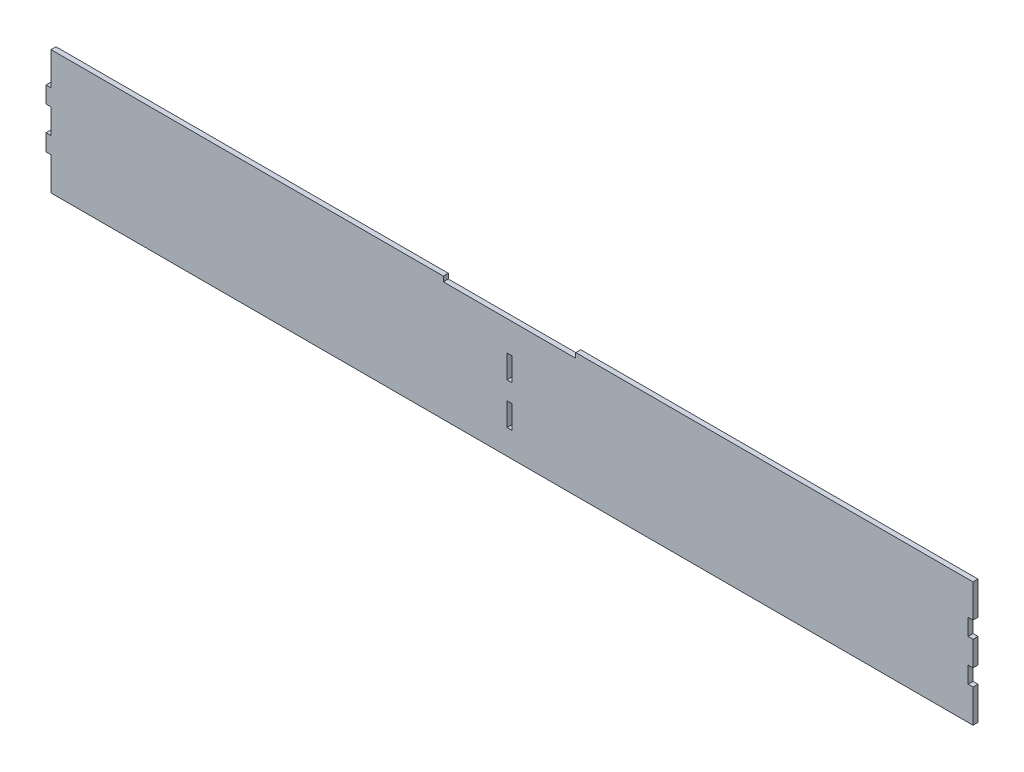
ISO-10303-21;
HEADER;
FILE_DESCRIPTION(('STEP AP214'),'2;1');
FILE_NAME('part.step','',(''),(''),'','','');
FILE_SCHEMA(('AUTOMOTIVE_DESIGN { 1 0 10303 214 1 1 1 1 }'));
ENDSEC;
DATA;
#1=APPLICATION_CONTEXT('core data for automotive mechanical design processes');
#2=APPLICATION_PROTOCOL_DEFINITION('international standard','automotive_design',2000,#1);
#3=PRODUCT_CONTEXT('',#1,'mechanical');
#4=PRODUCT('Part','Part','',(#3));
#5=PRODUCT_RELATED_PRODUCT_CATEGORY('part','',(#4));
#6=PRODUCT_DEFINITION_FORMATION('','',#4);
#7=PRODUCT_DEFINITION_CONTEXT('part definition',#1,'design');
#8=PRODUCT_DEFINITION('design','',#6,#7);
#9=PRODUCT_DEFINITION_SHAPE('','',#8);
#10=(LENGTH_UNIT() NAMED_UNIT(*) SI_UNIT(.MILLI.,.METRE.));
#11=(NAMED_UNIT(*) PLANE_ANGLE_UNIT() SI_UNIT($,.RADIAN.));
#12=(NAMED_UNIT(*) SI_UNIT($,.STERADIAN.) SOLID_ANGLE_UNIT());
#13=UNCERTAINTY_MEASURE_WITH_UNIT(LENGTH_MEASURE(1.E-05),#10,'distance_accuracy_value','');
#14=(GEOMETRIC_REPRESENTATION_CONTEXT(3) GLOBAL_UNCERTAINTY_ASSIGNED_CONTEXT((#13)) GLOBAL_UNIT_ASSIGNED_CONTEXT((#10,
#11,#12)) REPRESENTATION_CONTEXT('',''));
#15=CARTESIAN_POINT('',(0.,0.,0.));
#16=DIRECTION('',(0.,0.,1.));
#17=DIRECTION('',(1.,0.,0.));
#18=AXIS2_PLACEMENT_3D('',#15,#16,#17);
#19=CARTESIAN_POINT('',(-232.344937666755,214.488975695473,3.));
#20=DIRECTION('',(0.,1.,0.));
#21=DIRECTION('',(0.,0.,1.));
#22=AXIS2_PLACEMENT_3D('',#19,#20,#21);
#23=PLANE('',#22);
#24=DIRECTION('',(1.,0.,0.));
#25=VECTOR('',#24,1.);
#26=CARTESIAN_POINT('',(-232.344937666755,214.488975695473,0.));
#27=LINE('',#26,#25);
#28=CARTESIAN_POINT('',(87.6550623332451,214.488975695473,0.));
#29=VERTEX_POINT('',#28);
#30=CARTESIAN_POINT('',(327.655062333245,214.488975695473,0.));
#31=VERTEX_POINT('',#30);
#32=EDGE_CURVE('E554',#29,#31,#27,.T.);
#33=ORIENTED_EDGE('',*,*,#32,.F.);
#34=DIRECTION('',(0.,0.,1.));
#35=VECTOR('',#34,1.);
#36=CARTESIAN_POINT('',(87.6550623332451,214.488975695473,0.));
#37=LINE('',#36,#35);
#38=CARTESIAN_POINT('',(87.6550623332452,214.488975695473,3.));
#39=VERTEX_POINT('',#38);
#40=EDGE_CURVE('E327',#29,#39,#37,.T.);
#41=ORIENTED_EDGE('',*,*,#40,.T.);
#42=DIRECTION('',(1.,0.,0.));
#43=VECTOR('',#42,1.);
#44=CARTESIAN_POINT('',(-232.344937666755,214.488975695473,3.));
#45=LINE('',#44,#43);
#46=CARTESIAN_POINT('',(327.655062333245,214.488975695473,3.));
#47=VERTEX_POINT('',#46);
#48=EDGE_CURVE('E457',#39,#47,#45,.T.);
#49=ORIENTED_EDGE('',*,*,#48,.T.);
#50=DIRECTION('',(0.,0.,-1.));
#51=VECTOR('',#50,1.);
#52=CARTESIAN_POINT('',(327.655062333245,214.488975695473,3.));
#53=LINE('',#52,#51);
#54=EDGE_CURVE('E481',#47,#31,#53,.T.);
#55=ORIENTED_EDGE('',*,*,#54,.T.);
#56=EDGE_LOOP('',(#33,#41,#49,#55));
#57=FACE_BOUND('',#56,.T.);
#58=ADVANCED_FACE('F39',(#57),#23,.T.);
#59=CARTESIAN_POINT('',(0.,0.,3.));
#60=DIRECTION('',(0.,0.,-1.));
#61=DIRECTION('',(-1.,0.,0.));
#62=AXIS2_PLACEMENT_3D('',#59,#60,#61);
#63=PLANE('',#62);
#64=DIRECTION('',(0.,1.,0.));
#65=VECTOR('',#64,1.);
#66=CARTESIAN_POINT('',(49.1550623332451,0.,3.));
#67=LINE('',#66,#65);
#68=CARTESIAN_POINT('',(49.1550623332451,179.488975695473,3.));
#69=VERTEX_POINT('',#68);
#70=CARTESIAN_POINT('',(49.1550623332451,193.488975695473,3.));
#71=VERTEX_POINT('',#70);
#72=EDGE_CURVE('E264',#69,#71,#67,.T.);
#73=ORIENTED_EDGE('',*,*,#72,.F.);
#74=DIRECTION('',(1.,0.,0.));
#75=VECTOR('',#74,1.);
#76=CARTESIAN_POINT('',(0.,179.488975695473,3.));
#77=LINE('',#76,#75);
#78=CARTESIAN_POINT('',(46.1550623332451,179.488975695473,3.));
#79=VERTEX_POINT('',#78);
#80=EDGE_CURVE('E54',#79,#69,#77,.T.);
#81=ORIENTED_EDGE('',*,*,#80,.F.);
#82=DIRECTION('',(0.,1.,0.));
#83=VECTOR('',#82,1.);
#84=CARTESIAN_POINT('',(46.1550623332451,0.,3.));
#85=LINE('',#84,#83);
#86=CARTESIAN_POINT('',(46.1550623332451,193.488975695473,3.));
#87=VERTEX_POINT('',#86);
#88=EDGE_CURVE('E271',#79,#87,#85,.T.);
#89=ORIENTED_EDGE('',*,*,#88,.T.);
#90=DIRECTION('',(1.,0.,0.));
#91=VECTOR('',#90,1.);
#92=CARTESIAN_POINT('',(0.,193.488975695473,3.));
#93=LINE('',#92,#91);
#94=EDGE_CURVE('E254',#87,#71,#93,.T.);
#95=ORIENTED_EDGE('',*,*,#94,.T.);
#96=EDGE_LOOP('',(#73,#81,#89,#95));
#97=FACE_BOUND('',#96,.T.);
#98=DIRECTION('',(0.,1.,0.));
#99=VECTOR('',#98,1.);
#100=CARTESIAN_POINT('',(49.1550623332451,0.,3.));
#101=LINE('',#100,#99);
#102=CARTESIAN_POINT('',(49.1550623332451,154.488975695473,3.));
#103=VERTEX_POINT('',#102);
#104=CARTESIAN_POINT('',(49.1550623332451,168.488975695473,3.));
#105=VERTEX_POINT('',#104);
#106=EDGE_CURVE('E282',#103,#105,#101,.T.);
#107=ORIENTED_EDGE('',*,*,#106,.F.);
#108=DIRECTION('',(1.,0.,0.));
#109=VECTOR('',#108,1.);
#110=CARTESIAN_POINT('',(0.,154.488975695473,3.));
#111=LINE('',#110,#109);
#112=CARTESIAN_POINT('',(46.1550623332451,154.488975695473,3.));
#113=VERTEX_POINT('',#112);
#114=EDGE_CURVE('E62',#113,#103,#111,.T.);
#115=ORIENTED_EDGE('',*,*,#114,.F.);
#116=DIRECTION('',(0.,1.,0.));
#117=VECTOR('',#116,1.);
#118=CARTESIAN_POINT('',(46.1550623332451,0.,3.));
#119=LINE('',#118,#117);
#120=CARTESIAN_POINT('',(46.1550623332451,168.488975695473,3.));
#121=VERTEX_POINT('',#120);
#122=EDGE_CURVE('E288',#113,#121,#119,.T.);
#123=ORIENTED_EDGE('',*,*,#122,.T.);
#124=DIRECTION('',(1.,0.,0.));
#125=VECTOR('',#124,1.);
#126=CARTESIAN_POINT('',(0.,168.488975695473,3.));
#127=LINE('',#126,#125);
#128=EDGE_CURVE('E285',#121,#105,#127,.T.);
#129=ORIENTED_EDGE('',*,*,#128,.T.);
#130=EDGE_LOOP('',(#107,#115,#123,#129));
#131=FACE_BOUND('',#130,.T.);
#132=DIRECTION('',(1.,0.,0.));
#133=VECTOR('',#132,1.);
#134=CARTESIAN_POINT('',(7.65506233324513,211.488975695473,3.));
#135=LINE('',#134,#133);
#136=CARTESIAN_POINT('',(7.65506233324513,211.488975695473,3.));
#137=VERTEX_POINT('',#136);
#138=CARTESIAN_POINT('',(87.6550623332451,211.488975695473,3.));
#139=VERTEX_POINT('',#138);
#140=EDGE_CURVE('E278',#137,#139,#135,.T.);
#141=ORIENTED_EDGE('',*,*,#140,.F.);
#142=DIRECTION('',(0.,-1.,0.));
#143=VECTOR('',#142,1.);
#144=CARTESIAN_POINT('',(7.65506233324513,214.488975695473,3.));
#145=LINE('',#144,#143);
#146=CARTESIAN_POINT('',(7.65506233324513,214.488975695473,3.));
#147=VERTEX_POINT('',#146);
#148=EDGE_CURVE('E303',#147,#137,#145,.T.);
#149=ORIENTED_EDGE('',*,*,#148,.F.);
#150=CARTESIAN_POINT('',(-229.344937666755,214.488975695473,3.));
#151=VERTEX_POINT('',#150);
#152=EDGE_CURVE('E356',#151,#147,#45,.T.);
#153=ORIENTED_EDGE('',*,*,#152,.F.);
#154=DIRECTION('',(0.,-1.,0.));
#155=VECTOR('',#154,1.);
#156=CARTESIAN_POINT('',(-229.344937666755,214.488975695473,3.));
#157=LINE('',#156,#155);
#158=CARTESIAN_POINT('',(-229.344937666755,194.488975695473,3.));
#159=VERTEX_POINT('',#158);
#160=EDGE_CURVE('E335',#151,#159,#157,.T.);
#161=ORIENTED_EDGE('',*,*,#160,.T.);
#162=DIRECTION('',(1.,0.,0.));
#163=VECTOR('',#162,1.);
#164=CARTESIAN_POINT('',(-232.344937666755,194.488975695473,3.));
#165=LINE('',#164,#163);
#166=CARTESIAN_POINT('',(-232.344937666755,194.488975695473,3.));
#167=VERTEX_POINT('',#166);
#168=EDGE_CURVE('E338',#167,#159,#165,.T.);
#169=ORIENTED_EDGE('',*,*,#168,.F.);
#170=DIRECTION('',(0.,-1.,0.));
#171=VECTOR('',#170,1.);
#172=CARTESIAN_POINT('',(-232.344937666755,214.488975695473,3.));
#173=LINE('',#172,#171);
#174=CARTESIAN_POINT('',(-232.344937666755,184.488975695473,3.));
#175=VERTEX_POINT('',#174);
#176=EDGE_CURVE('E355',#167,#175,#173,.T.);
#177=ORIENTED_EDGE('',*,*,#176,.T.);
#178=DIRECTION('',(1.,0.,0.));
#179=VECTOR('',#178,1.);
#180=CARTESIAN_POINT('',(-232.344937666755,184.488975695473,3.));
#181=LINE('',#180,#179);
#182=CARTESIAN_POINT('',(-229.344937666755,184.488975695473,3.));
#183=VERTEX_POINT('',#182);
#184=EDGE_CURVE('E342',#175,#183,#181,.T.);
#185=ORIENTED_EDGE('',*,*,#184,.T.);
#186=DIRECTION('',(0.,1.,0.));
#187=VECTOR('',#186,1.);
#188=CARTESIAN_POINT('',(-229.344937666755,169.488975695473,3.));
#189=LINE('',#188,#187);
#190=CARTESIAN_POINT('',(-229.344937666755,169.488975695473,3.));
#191=VERTEX_POINT('',#190);
#192=EDGE_CURVE('E627',#191,#183,#189,.T.);
#193=ORIENTED_EDGE('',*,*,#192,.F.);
#194=DIRECTION('',(1.,0.,0.));
#195=VECTOR('',#194,1.);
#196=CARTESIAN_POINT('',(-232.344937666755,169.488975695473,3.));
#197=LINE('',#196,#195);
#198=CARTESIAN_POINT('',(-232.344937666755,169.488975695473,3.));
#199=VERTEX_POINT('',#198);
#200=EDGE_CURVE('E623',#199,#191,#197,.T.);
#201=ORIENTED_EDGE('',*,*,#200,.F.);
#202=CARTESIAN_POINT('',(-232.344937666755,159.488975695473,3.));
#203=VERTEX_POINT('',#202);
#204=EDGE_CURVE('E351',#199,#203,#173,.T.);
#205=ORIENTED_EDGE('',*,*,#204,.T.);
#206=DIRECTION('',(1.,0.,0.));
#207=VECTOR('',#206,1.);
#208=CARTESIAN_POINT('',(-232.344937666755,159.488975695473,3.));
#209=LINE('',#208,#207);
#210=CARTESIAN_POINT('',(-229.344937666755,159.488975695473,3.));
#211=VERTEX_POINT('',#210);
#212=EDGE_CURVE('E370',#203,#211,#209,.T.);
#213=ORIENTED_EDGE('',*,*,#212,.T.);
#214=DIRECTION('',(0.,1.,0.));
#215=VECTOR('',#214,1.);
#216=CARTESIAN_POINT('',(-229.344937666755,139.488975695473,3.));
#217=LINE('',#216,#215);
#218=CARTESIAN_POINT('',(-229.344937666755,139.488975695473,3.));
#219=VERTEX_POINT('',#218);
#220=EDGE_CURVE('E375',#219,#211,#217,.T.);
#221=ORIENTED_EDGE('',*,*,#220,.F.);
#222=DIRECTION('',(1.,0.,0.));
#223=VECTOR('',#222,1.);
#224=CARTESIAN_POINT('',(-232.344937666755,139.488975695473,3.));
#225=LINE('',#224,#223);
#226=CARTESIAN_POINT('',(327.655062333245,139.488975695473,3.));
#227=VERTEX_POINT('',#226);
#228=EDGE_CURVE('E450',#219,#227,#225,.T.);
#229=ORIENTED_EDGE('',*,*,#228,.T.);
#230=DIRECTION('',(0.,-1.,0.));
#231=VECTOR('',#230,1.);
#232=CARTESIAN_POINT('',(327.655062333245,214.488975695473,3.));
#233=LINE('',#232,#231);
#234=CARTESIAN_POINT('',(327.655062333245,159.488975695473,3.));
#235=VERTEX_POINT('',#234);
#236=EDGE_CURVE('E452',#235,#227,#233,.T.);
#237=ORIENTED_EDGE('',*,*,#236,.F.);
#238=DIRECTION('',(-1.,0.,0.));
#239=VECTOR('',#238,1.);
#240=CARTESIAN_POINT('',(327.655062333245,159.488975695473,3.));
#241=LINE('',#240,#239);
#242=CARTESIAN_POINT('',(324.655062333245,159.488975695473,3.));
#243=VERTEX_POINT('',#242);
#244=EDGE_CURVE('E430',#235,#243,#241,.T.);
#245=ORIENTED_EDGE('',*,*,#244,.T.);
#246=DIRECTION('',(0.,1.,0.));
#247=VECTOR('',#246,1.);
#248=CARTESIAN_POINT('',(324.655062333245,159.488975695473,3.));
#249=LINE('',#248,#247);
#250=CARTESIAN_POINT('',(324.655062333245,169.488975695473,3.));
#251=VERTEX_POINT('',#250);
#252=EDGE_CURVE('E434',#243,#251,#249,.T.);
#253=ORIENTED_EDGE('',*,*,#252,.T.);
#254=DIRECTION('',(-1.,0.,0.));
#255=VECTOR('',#254,1.);
#256=CARTESIAN_POINT('',(327.655062333245,169.488975695473,3.));
#257=LINE('',#256,#255);
#258=CARTESIAN_POINT('',(327.655062333245,169.488975695473,3.));
#259=VERTEX_POINT('',#258);
#260=EDGE_CURVE('E399',#259,#251,#257,.T.);
#261=ORIENTED_EDGE('',*,*,#260,.F.);
#262=CARTESIAN_POINT('',(327.655062333245,184.488975695473,3.));
#263=VERTEX_POINT('',#262);
#264=EDGE_CURVE('E458',#263,#259,#233,.T.);
#265=ORIENTED_EDGE('',*,*,#264,.F.);
#266=DIRECTION('',(-1.,0.,0.));
#267=VECTOR('',#266,1.);
#268=CARTESIAN_POINT('',(327.655062333245,184.488975695473,3.));
#269=LINE('',#268,#267);
#270=CARTESIAN_POINT('',(324.655062333245,184.488975695473,3.));
#271=VERTEX_POINT('',#270);
#272=EDGE_CURVE('E394',#263,#271,#269,.T.);
#273=ORIENTED_EDGE('',*,*,#272,.T.);
#274=DIRECTION('',(0.,-1.,0.));
#275=VECTOR('',#274,1.);
#276=CARTESIAN_POINT('',(324.655062333245,194.488975695473,3.));
#277=LINE('',#276,#275);
#278=CARTESIAN_POINT('',(324.655062333245,194.488975695473,3.));
#279=VERTEX_POINT('',#278);
#280=EDGE_CURVE('E398',#279,#271,#277,.T.);
#281=ORIENTED_EDGE('',*,*,#280,.F.);
#282=DIRECTION('',(-1.,0.,0.));
#283=VECTOR('',#282,1.);
#284=CARTESIAN_POINT('',(327.655062333245,194.488975695473,3.));
#285=LINE('',#284,#283);
#286=CARTESIAN_POINT('',(327.655062333245,194.488975695473,3.));
#287=VERTEX_POINT('',#286);
#288=EDGE_CURVE('E387',#287,#279,#285,.T.);
#289=ORIENTED_EDGE('',*,*,#288,.F.);
#290=EDGE_CURVE('E454',#47,#287,#233,.T.);
#291=ORIENTED_EDGE('',*,*,#290,.F.);
#292=ORIENTED_EDGE('',*,*,#48,.F.);
#293=DIRECTION('',(0.,-1.,0.));
#294=VECTOR('',#293,1.);
#295=CARTESIAN_POINT('',(87.6550623332451,214.488975695473,3.));
#296=LINE('',#295,#294);
#297=EDGE_CURVE('E311',#39,#139,#296,.T.);
#298=ORIENTED_EDGE('',*,*,#297,.T.);
#299=EDGE_LOOP('',(#141,#149,#153,#161,#169,#177,#185,#193,#201,#205,#213,#221,#229,#237,#245,
#253,#261,#265,#273,#281,#289,#291,#292,#298));
#300=FACE_BOUND('',#299,.T.);
#301=ADVANCED_FACE('F268',(#97,#131,#300),#63,.F.);
#302=CARTESIAN_POINT('',(0.,0.,0.));
#303=DIRECTION('',(0.,0.,-1.));
#304=DIRECTION('',(-1.,0.,0.));
#305=AXIS2_PLACEMENT_3D('',#302,#303,#304);
#306=PLANE('',#305);
#307=DIRECTION('',(-1.,0.,0.));
#308=VECTOR('',#307,1.);
#309=CARTESIAN_POINT('',(0.,179.488975695473,0.));
#310=LINE('',#309,#308);
#311=CARTESIAN_POINT('',(49.1550623332451,179.488975695473,0.));
#312=VERTEX_POINT('',#311);
#313=CARTESIAN_POINT('',(46.1550623332451,179.488975695473,0.));
#314=VERTEX_POINT('',#313);
#315=EDGE_CURVE('E12',#312,#314,#310,.T.);
#316=ORIENTED_EDGE('',*,*,#315,.F.);
#317=DIRECTION('',(0.,-1.,0.));
#318=VECTOR('',#317,1.);
#319=CARTESIAN_POINT('',(49.1550623332451,0.,0.));
#320=LINE('',#319,#318);
#321=CARTESIAN_POINT('',(49.1550623332451,193.488975695473,0.));
#322=VERTEX_POINT('',#321);
#323=EDGE_CURVE('E496',#322,#312,#320,.T.);
#324=ORIENTED_EDGE('',*,*,#323,.F.);
#325=DIRECTION('',(-1.,0.,0.));
#326=VECTOR('',#325,1.);
#327=CARTESIAN_POINT('',(0.,193.488975695473,0.));
#328=LINE('',#327,#326);
#329=CARTESIAN_POINT('',(46.1550623332451,193.488975695473,0.));
#330=VERTEX_POINT('',#329);
#331=EDGE_CURVE('E257',#322,#330,#328,.T.);
#332=ORIENTED_EDGE('',*,*,#331,.T.);
#333=DIRECTION('',(0.,-1.,0.));
#334=VECTOR('',#333,1.);
#335=CARTESIAN_POINT('',(46.1550623332451,0.,0.));
#336=LINE('',#335,#334);
#337=EDGE_CURVE('E47',#330,#314,#336,.T.);
#338=ORIENTED_EDGE('',*,*,#337,.T.);
#339=EDGE_LOOP('',(#316,#324,#332,#338));
#340=FACE_BOUND('',#339,.T.);
#341=DIRECTION('',(-1.,0.,0.));
#342=VECTOR('',#341,1.);
#343=CARTESIAN_POINT('',(0.,154.488975695473,0.));
#344=LINE('',#343,#342);
#345=CARTESIAN_POINT('',(49.1550623332451,154.488975695473,0.));
#346=VERTEX_POINT('',#345);
#347=CARTESIAN_POINT('',(46.1550623332451,154.488975695473,0.));
#348=VERTEX_POINT('',#347);
#349=EDGE_CURVE('E494',#346,#348,#344,.T.);
#350=ORIENTED_EDGE('',*,*,#349,.F.);
#351=DIRECTION('',(0.,-1.,0.));
#352=VECTOR('',#351,1.);
#353=CARTESIAN_POINT('',(49.1550623332451,0.,0.));
#354=LINE('',#353,#352);
#355=CARTESIAN_POINT('',(49.1550623332451,168.488975695473,0.));
#356=VERTEX_POINT('',#355);
#357=EDGE_CURVE('E480',#356,#346,#354,.T.);
#358=ORIENTED_EDGE('',*,*,#357,.F.);
#359=DIRECTION('',(-1.,0.,0.));
#360=VECTOR('',#359,1.);
#361=CARTESIAN_POINT('',(0.,168.488975695473,0.));
#362=LINE('',#361,#360);
#363=CARTESIAN_POINT('',(46.1550623332451,168.488975695473,0.));
#364=VERTEX_POINT('',#363);
#365=EDGE_CURVE('E483',#356,#364,#362,.T.);
#366=ORIENTED_EDGE('',*,*,#365,.T.);
#367=DIRECTION('',(0.,-1.,0.));
#368=VECTOR('',#367,1.);
#369=CARTESIAN_POINT('',(46.1550623332451,0.,0.));
#370=LINE('',#369,#368);
#371=EDGE_CURVE('E491',#364,#348,#370,.T.);
#372=ORIENTED_EDGE('',*,*,#371,.T.);
#373=EDGE_LOOP('',(#350,#358,#366,#372));
#374=FACE_BOUND('',#373,.T.);
#375=DIRECTION('',(0.,-1.,0.));
#376=VECTOR('',#375,1.);
#377=CARTESIAN_POINT('',(7.65506233324513,214.488975695473,0.));
#378=LINE('',#377,#376);
#379=CARTESIAN_POINT('',(7.65506233324513,214.488975695473,0.));
#380=VERTEX_POINT('',#379);
#381=CARTESIAN_POINT('',(7.65506233324513,211.488975695473,0.));
#382=VERTEX_POINT('',#381);
#383=EDGE_CURVE('E305',#380,#382,#378,.T.);
#384=ORIENTED_EDGE('',*,*,#383,.T.);
#385=DIRECTION('',(1.,0.,0.));
#386=VECTOR('',#385,1.);
#387=CARTESIAN_POINT('',(7.65506233324513,211.488975695473,0.));
#388=LINE('',#387,#386);
#389=CARTESIAN_POINT('',(87.6550623332451,211.488975695473,0.));
#390=VERTEX_POINT('',#389);
#391=EDGE_CURVE('E299',#382,#390,#388,.T.);
#392=ORIENTED_EDGE('',*,*,#391,.T.);
#393=DIRECTION('',(0.,-1.,0.));
#394=VECTOR('',#393,1.);
#395=CARTESIAN_POINT('',(87.6550623332451,214.488975695473,0.));
#396=LINE('',#395,#394);
#397=EDGE_CURVE('E302',#29,#390,#396,.T.);
#398=ORIENTED_EDGE('',*,*,#397,.F.);
#399=ORIENTED_EDGE('',*,*,#32,.T.);
#400=DIRECTION('',(0.,-1.,0.));
#401=VECTOR('',#400,1.);
#402=CARTESIAN_POINT('',(327.655062333245,214.488975695473,0.));
#403=LINE('',#402,#401);
#404=CARTESIAN_POINT('',(327.655062333245,194.488975695473,0.));
#405=VERTEX_POINT('',#404);
#406=EDGE_CURVE('E557',#31,#405,#403,.T.);
#407=ORIENTED_EDGE('',*,*,#406,.T.);
#408=DIRECTION('',(-1.,0.,0.));
#409=VECTOR('',#408,1.);
#410=CARTESIAN_POINT('',(327.655062333245,194.488975695473,0.));
#411=LINE('',#410,#409);
#412=CARTESIAN_POINT('',(324.655062333245,194.488975695473,0.));
#413=VERTEX_POINT('',#412);
#414=EDGE_CURVE('E390',#405,#413,#411,.T.);
#415=ORIENTED_EDGE('',*,*,#414,.T.);
#416=DIRECTION('',(0.,-1.,0.));
#417=VECTOR('',#416,1.);
#418=CARTESIAN_POINT('',(324.655062333245,194.488975695473,0.));
#419=LINE('',#418,#417);
#420=CARTESIAN_POINT('',(324.655062333245,184.488975695473,0.));
#421=VERTEX_POINT('',#420);
#422=EDGE_CURVE('E386',#413,#421,#419,.T.);
#423=ORIENTED_EDGE('',*,*,#422,.T.);
#424=DIRECTION('',(-1.,0.,0.));
#425=VECTOR('',#424,1.);
#426=CARTESIAN_POINT('',(327.655062333245,184.488975695473,0.));
#427=LINE('',#426,#425);
#428=CARTESIAN_POINT('',(327.655062333245,184.488975695473,0.));
#429=VERTEX_POINT('',#428);
#430=EDGE_CURVE('E384',#429,#421,#427,.T.);
#431=ORIENTED_EDGE('',*,*,#430,.F.);
#432=CARTESIAN_POINT('',(327.655062333245,169.488975695473,0.));
#433=VERTEX_POINT('',#432);
#434=EDGE_CURVE('E559',#429,#433,#403,.T.);
#435=ORIENTED_EDGE('',*,*,#434,.T.);
#436=DIRECTION('',(-1.,0.,0.));
#437=VECTOR('',#436,1.);
#438=CARTESIAN_POINT('',(327.655062333245,169.488975695473,0.));
#439=LINE('',#438,#437);
#440=CARTESIAN_POINT('',(324.655062333245,169.488975695473,0.));
#441=VERTEX_POINT('',#440);
#442=EDGE_CURVE('E435',#433,#441,#439,.T.);
#443=ORIENTED_EDGE('',*,*,#442,.T.);
#444=DIRECTION('',(0.,1.,0.));
#445=VECTOR('',#444,1.);
#446=CARTESIAN_POINT('',(324.655062333245,159.488975695473,0.));
#447=LINE('',#446,#445);
#448=CARTESIAN_POINT('',(324.655062333245,159.488975695473,0.));
#449=VERTEX_POINT('',#448);
#450=EDGE_CURVE('E446',#449,#441,#447,.T.);
#451=ORIENTED_EDGE('',*,*,#450,.F.);
#452=DIRECTION('',(-1.,0.,0.));
#453=VECTOR('',#452,1.);
#454=CARTESIAN_POINT('',(327.655062333245,159.488975695473,0.));
#455=LINE('',#454,#453);
#456=CARTESIAN_POINT('',(327.655062333245,159.488975695473,0.));
#457=VERTEX_POINT('',#456);
#458=EDGE_CURVE('E421',#457,#449,#455,.T.);
#459=ORIENTED_EDGE('',*,*,#458,.F.);
#460=CARTESIAN_POINT('',(327.655062333245,139.488975695473,0.));
#461=VERTEX_POINT('',#460);
#462=EDGE_CURVE('E560',#457,#461,#403,.T.);
#463=ORIENTED_EDGE('',*,*,#462,.T.);
#464=DIRECTION('',(1.,0.,0.));
#465=VECTOR('',#464,1.);
#466=CARTESIAN_POINT('',(-232.344937666755,139.488975695473,0.));
#467=LINE('',#466,#465);
#468=CARTESIAN_POINT('',(-229.344937666755,139.488975695473,0.));
#469=VERTEX_POINT('',#468);
#470=EDGE_CURVE('E359',#469,#461,#467,.T.);
#471=ORIENTED_EDGE('',*,*,#470,.F.);
#472=DIRECTION('',(0.,1.,0.));
#473=VECTOR('',#472,1.);
#474=CARTESIAN_POINT('',(-229.344937666755,139.488975695473,0.));
#475=LINE('',#474,#473);
#476=CARTESIAN_POINT('',(-229.344937666755,159.488975695473,0.));
#477=VERTEX_POINT('',#476);
#478=EDGE_CURVE('E378',#469,#477,#475,.T.);
#479=ORIENTED_EDGE('',*,*,#478,.T.);
#480=DIRECTION('',(1.,0.,0.));
#481=VECTOR('',#480,1.);
#482=CARTESIAN_POINT('',(-232.344937666755,159.488975695473,0.));
#483=LINE('',#482,#481);
#484=CARTESIAN_POINT('',(-232.344937666755,159.488975695473,0.));
#485=VERTEX_POINT('',#484);
#486=EDGE_CURVE('E381',#485,#477,#483,.T.);
#487=ORIENTED_EDGE('',*,*,#486,.F.);
#488=DIRECTION('',(0.,-1.,0.));
#489=VECTOR('',#488,1.);
#490=CARTESIAN_POINT('',(-232.344937666755,214.488975695473,0.));
#491=LINE('',#490,#489);
#492=CARTESIAN_POINT('',(-232.344937666755,169.488975695473,0.));
#493=VERTEX_POINT('',#492);
#494=EDGE_CURVE('E553',#493,#485,#491,.T.);
#495=ORIENTED_EDGE('',*,*,#494,.F.);
#496=DIRECTION('',(1.,0.,0.));
#497=VECTOR('',#496,1.);
#498=CARTESIAN_POINT('',(-232.344937666755,169.488975695473,0.));
#499=LINE('',#498,#497);
#500=CARTESIAN_POINT('',(-229.344937666755,169.488975695473,0.));
#501=VERTEX_POINT('',#500);
#502=EDGE_CURVE('E622',#493,#501,#499,.T.);
#503=ORIENTED_EDGE('',*,*,#502,.T.);
#504=DIRECTION('',(0.,1.,0.));
#505=VECTOR('',#504,1.);
#506=CARTESIAN_POINT('',(-229.344937666755,169.488975695473,0.));
#507=LINE('',#506,#505);
#508=CARTESIAN_POINT('',(-229.344937666755,184.488975695473,0.));
#509=VERTEX_POINT('',#508);
#510=EDGE_CURVE('E636',#501,#509,#507,.T.);
#511=ORIENTED_EDGE('',*,*,#510,.T.);
#512=DIRECTION('',(1.,0.,0.));
#513=VECTOR('',#512,1.);
#514=CARTESIAN_POINT('',(-232.344937666755,184.488975695473,0.));
#515=LINE('',#514,#513);
#516=CARTESIAN_POINT('',(-232.344937666755,184.488975695473,0.));
#517=VERTEX_POINT('',#516);
#518=EDGE_CURVE('E628',#517,#509,#515,.T.);
#519=ORIENTED_EDGE('',*,*,#518,.F.);
#520=CARTESIAN_POINT('',(-232.344937666755,194.488975695473,0.));
#521=VERTEX_POINT('',#520);
#522=EDGE_CURVE('E453',#521,#517,#491,.T.);
#523=ORIENTED_EDGE('',*,*,#522,.F.);
#524=DIRECTION('',(1.,0.,0.));
#525=VECTOR('',#524,1.);
#526=CARTESIAN_POINT('',(-232.344937666755,194.488975695473,0.));
#527=LINE('',#526,#525);
#528=CARTESIAN_POINT('',(-229.344937666755,194.488975695473,0.));
#529=VERTEX_POINT('',#528);
#530=EDGE_CURVE('E331',#521,#529,#527,.T.);
#531=ORIENTED_EDGE('',*,*,#530,.T.);
#532=DIRECTION('',(0.,-1.,0.));
#533=VECTOR('',#532,1.);
#534=CARTESIAN_POINT('',(-229.344937666755,214.488975695473,0.));
#535=LINE('',#534,#533);
#536=CARTESIAN_POINT('',(-229.344937666755,214.488975695473,0.));
#537=VERTEX_POINT('',#536);
#538=EDGE_CURVE('E334',#537,#529,#535,.T.);
#539=ORIENTED_EDGE('',*,*,#538,.F.);
#540=EDGE_CURVE('E547',#537,#380,#27,.T.);
#541=ORIENTED_EDGE('',*,*,#540,.T.);
#542=EDGE_LOOP('',(#384,#392,#398,#399,#407,#415,#423,#431,#435,#443,#451,#459,#463,#471,#479,
#487,#495,#503,#511,#519,#523,#531,#539,#541));
#543=FACE_BOUND('',#542,.T.);
#544=ADVANCED_FACE('F501',(#340,#374,#543),#306,.T.);
#545=DIRECTION('',(0.,0.,1.));
#546=VECTOR('',#545,1.);
#547=CARTESIAN_POINT('',(7.65506233324513,214.488975695473,0.));
#548=LINE('',#547,#546);
#549=EDGE_CURVE('E325',#380,#147,#548,.T.);
#550=ORIENTED_EDGE('',*,*,#549,.F.);
#551=ORIENTED_EDGE('',*,*,#540,.F.);
#552=DIRECTION('',(0.,0.,1.));
#553=VECTOR('',#552,1.);
#554=CARTESIAN_POINT('',(-229.344937666755,214.488975695473,0.));
#555=LINE('',#554,#553);
#556=EDGE_CURVE('E610',#537,#151,#555,.T.);
#557=ORIENTED_EDGE('',*,*,#556,.T.);
#558=ORIENTED_EDGE('',*,*,#152,.T.);
#559=EDGE_LOOP('',(#550,#551,#557,#558));
#560=FACE_BOUND('',#559,.T.);
#561=ADVANCED_FACE('F523',(#560),#23,.T.);
#562=CARTESIAN_POINT('',(-232.344937666755,214.488975695473,3.));
#563=DIRECTION('',(1.,0.,0.));
#564=DIRECTION('',(0.,1.,0.));
#565=AXIS2_PLACEMENT_3D('',#562,#563,#564);
#566=PLANE('',#565);
#567=ORIENTED_EDGE('',*,*,#176,.F.);
#568=DIRECTION('',(0.,0.,1.));
#569=VECTOR('',#568,1.);
#570=CARTESIAN_POINT('',(-232.344937666755,194.488975695473,0.));
#571=LINE('',#570,#569);
#572=EDGE_CURVE('E429',#521,#167,#571,.T.);
#573=ORIENTED_EDGE('',*,*,#572,.F.);
#574=ORIENTED_EDGE('',*,*,#522,.T.);
#575=DIRECTION('',(0.,0.,1.));
#576=VECTOR('',#575,1.);
#577=CARTESIAN_POINT('',(-232.344937666755,184.488975695473,0.));
#578=LINE('',#577,#576);
#579=EDGE_CURVE('E620',#517,#175,#578,.T.);
#580=ORIENTED_EDGE('',*,*,#579,.T.);
#581=EDGE_LOOP('',(#567,#573,#574,#580));
#582=FACE_BOUND('',#581,.T.);
#583=ADVANCED_FACE('F532',(#582),#566,.F.);
#584=ORIENTED_EDGE('',*,*,#204,.F.);
#585=DIRECTION('',(0.,0.,1.));
#586=VECTOR('',#585,1.);
#587=CARTESIAN_POINT('',(-232.344937666755,169.488975695473,0.));
#588=LINE('',#587,#586);
#589=EDGE_CURVE('E618',#493,#199,#588,.T.);
#590=ORIENTED_EDGE('',*,*,#589,.F.);
#591=ORIENTED_EDGE('',*,*,#494,.T.);
#592=DIRECTION('',(0.,0.,1.));
#593=VECTOR('',#592,1.);
#594=CARTESIAN_POINT('',(-232.344937666755,159.488975695473,0.));
#595=LINE('',#594,#593);
#596=EDGE_CURVE('E382',#485,#203,#595,.T.);
#597=ORIENTED_EDGE('',*,*,#596,.T.);
#598=EDGE_LOOP('',(#584,#590,#591,#597));
#599=FACE_BOUND('',#598,.T.);
#600=ADVANCED_FACE('F538',(#599),#566,.F.);
#601=CARTESIAN_POINT('',(327.655062333245,214.488975695473,3.));
#602=DIRECTION('',(1.,0.,0.));
#603=DIRECTION('',(0.,1.,0.));
#604=AXIS2_PLACEMENT_3D('',#601,#602,#603);
#605=PLANE('',#604);
#606=ORIENTED_EDGE('',*,*,#434,.F.);
#607=DIRECTION('',(0.,0.,1.));
#608=VECTOR('',#607,1.);
#609=CARTESIAN_POINT('',(327.655062333245,184.488975695473,0.));
#610=LINE('',#609,#608);
#611=EDGE_CURVE('E393',#429,#263,#610,.T.);
#612=ORIENTED_EDGE('',*,*,#611,.T.);
#613=ORIENTED_EDGE('',*,*,#264,.T.);
#614=DIRECTION('',(0.,0.,1.));
#615=VECTOR('',#614,1.);
#616=CARTESIAN_POINT('',(327.655062333245,169.488975695473,0.));
#617=LINE('',#616,#615);
#618=EDGE_CURVE('E427',#433,#259,#617,.T.);
#619=ORIENTED_EDGE('',*,*,#618,.F.);
#620=EDGE_LOOP('',(#606,#612,#613,#619));
#621=FACE_BOUND('',#620,.T.);
#622=ADVANCED_FACE('F580',(#621),#605,.T.);
#623=ORIENTED_EDGE('',*,*,#462,.F.);
#624=DIRECTION('',(0.,0.,1.));
#625=VECTOR('',#624,1.);
#626=CARTESIAN_POINT('',(327.655062333245,159.488975695473,0.));
#627=LINE('',#626,#625);
#628=EDGE_CURVE('E424',#457,#235,#627,.T.);
#629=ORIENTED_EDGE('',*,*,#628,.T.);
#630=ORIENTED_EDGE('',*,*,#236,.T.);
#631=DIRECTION('',(0.,0.,-1.));
#632=VECTOR('',#631,1.);
#633=CARTESIAN_POINT('',(327.655062333245,139.488975695473,3.));
#634=LINE('',#633,#632);
#635=EDGE_CURVE('E473',#227,#461,#634,.T.);
#636=ORIENTED_EDGE('',*,*,#635,.T.);
#637=EDGE_LOOP('',(#623,#629,#630,#636));
#638=FACE_BOUND('',#637,.T.);
#639=ADVANCED_FACE('F472',(#638),#605,.T.);
#640=CARTESIAN_POINT('',(-232.344937666755,139.488975695473,3.));
#641=DIRECTION('',(0.,1.,0.));
#642=DIRECTION('',(0.,0.,1.));
#643=AXIS2_PLACEMENT_3D('',#640,#641,#642);
#644=PLANE('',#643);
#645=ORIENTED_EDGE('',*,*,#228,.F.);
#646=DIRECTION('',(0.,0.,1.));
#647=VECTOR('',#646,1.);
#648=CARTESIAN_POINT('',(-229.344937666755,139.488975695473,0.));
#649=LINE('',#648,#647);
#650=EDGE_CURVE('E641',#469,#219,#649,.T.);
#651=ORIENTED_EDGE('',*,*,#650,.F.);
#652=ORIENTED_EDGE('',*,*,#470,.T.);
#653=ORIENTED_EDGE('',*,*,#635,.F.);
#654=EDGE_LOOP('',(#645,#651,#652,#653));
#655=FACE_BOUND('',#654,.T.);
#656=ADVANCED_FACE('F41',(#655),#644,.F.);
#657=DIRECTION('',(0.,0.,1.));
#658=VECTOR('',#657,1.);
#659=CARTESIAN_POINT('',(327.655062333245,194.488975695473,0.));
#660=LINE('',#659,#658);
#661=EDGE_CURVE('E413',#405,#287,#660,.T.);
#662=ORIENTED_EDGE('',*,*,#661,.F.);
#663=ORIENTED_EDGE('',*,*,#406,.F.);
#664=ORIENTED_EDGE('',*,*,#54,.F.);
#665=ORIENTED_EDGE('',*,*,#290,.T.);
#666=EDGE_LOOP('',(#662,#663,#664,#665));
#667=FACE_BOUND('',#666,.T.);
#668=ADVANCED_FACE('F594',(#667),#605,.T.);
#669=CARTESIAN_POINT('',(327.655062333245,169.488975695473,0.));
#670=DIRECTION('',(0.,1.,0.));
#671=DIRECTION('',(0.,0.,1.));
#672=AXIS2_PLACEMENT_3D('',#669,#670,#671);
#673=PLANE('',#672);
#674=ORIENTED_EDGE('',*,*,#260,.T.);
#675=DIRECTION('',(0.,0.,1.));
#676=VECTOR('',#675,1.);
#677=CARTESIAN_POINT('',(324.655062333245,169.488975695473,0.));
#678=LINE('',#677,#676);
#679=EDGE_CURVE('E419',#441,#251,#678,.T.);
#680=ORIENTED_EDGE('',*,*,#679,.F.);
#681=ORIENTED_EDGE('',*,*,#442,.F.);
#682=ORIENTED_EDGE('',*,*,#618,.T.);
#683=EDGE_LOOP('',(#674,#680,#681,#682));
#684=FACE_BOUND('',#683,.T.);
#685=ADVANCED_FACE('F576',(#684),#673,.F.);
#686=CARTESIAN_POINT('',(327.655062333245,159.488975695473,0.));
#687=DIRECTION('',(0.,1.,0.));
#688=DIRECTION('',(0.,0.,1.));
#689=AXIS2_PLACEMENT_3D('',#686,#687,#688);
#690=PLANE('',#689);
#691=ORIENTED_EDGE('',*,*,#244,.F.);
#692=ORIENTED_EDGE('',*,*,#628,.F.);
#693=ORIENTED_EDGE('',*,*,#458,.T.);
#694=DIRECTION('',(0.,0.,1.));
#695=VECTOR('',#694,1.);
#696=CARTESIAN_POINT('',(324.655062333245,159.488975695473,0.));
#697=LINE('',#696,#695);
#698=EDGE_CURVE('E422',#449,#243,#697,.T.);
#699=ORIENTED_EDGE('',*,*,#698,.T.);
#700=EDGE_LOOP('',(#691,#692,#693,#699));
#701=FACE_BOUND('',#700,.T.);
#702=ADVANCED_FACE('F566',(#701),#690,.T.);
#703=CARTESIAN_POINT('',(324.655062333245,159.488975695473,0.));
#704=DIRECTION('',(1.,0.,0.));
#705=DIRECTION('',(0.,1.,0.));
#706=AXIS2_PLACEMENT_3D('',#703,#704,#705);
#707=PLANE('',#706);
#708=ORIENTED_EDGE('',*,*,#252,.F.);
#709=ORIENTED_EDGE('',*,*,#698,.F.);
#710=ORIENTED_EDGE('',*,*,#450,.T.);
#711=ORIENTED_EDGE('',*,*,#679,.T.);
#712=EDGE_LOOP('',(#708,#709,#710,#711));
#713=FACE_BOUND('',#712,.T.);
#714=ADVANCED_FACE('F573',(#713),#707,.T.);
#715=CARTESIAN_POINT('',(327.655062333245,184.488975695473,0.));
#716=DIRECTION('',(0.,1.,0.));
#717=DIRECTION('',(0.,0.,1.));
#718=AXIS2_PLACEMENT_3D('',#715,#716,#717);
#719=PLANE('',#718);
#720=ORIENTED_EDGE('',*,*,#272,.F.);
#721=ORIENTED_EDGE('',*,*,#611,.F.);
#722=ORIENTED_EDGE('',*,*,#430,.T.);
#723=DIRECTION('',(0.,0.,1.));
#724=VECTOR('',#723,1.);
#725=CARTESIAN_POINT('',(324.655062333245,184.488975695473,0.));
#726=LINE('',#725,#724);
#727=EDGE_CURVE('E417',#421,#271,#726,.T.);
#728=ORIENTED_EDGE('',*,*,#727,.T.);
#729=EDGE_LOOP('',(#720,#721,#722,#728));
#730=FACE_BOUND('',#729,.T.);
#731=ADVANCED_FACE('F584',(#730),#719,.T.);
#732=CARTESIAN_POINT('',(324.655062333245,194.488975695473,0.));
#733=DIRECTION('',(-1.,0.,0.));
#734=DIRECTION('',(0.,0.,1.));
#735=AXIS2_PLACEMENT_3D('',#732,#733,#734);
#736=PLANE('',#735);
#737=ORIENTED_EDGE('',*,*,#280,.T.);
#738=ORIENTED_EDGE('',*,*,#727,.F.);
#739=ORIENTED_EDGE('',*,*,#422,.F.);
#740=DIRECTION('',(0.,0.,1.));
#741=VECTOR('',#740,1.);
#742=CARTESIAN_POINT('',(324.655062333245,194.488975695473,0.));
#743=LINE('',#742,#741);
#744=EDGE_CURVE('E415',#413,#279,#743,.T.);
#745=ORIENTED_EDGE('',*,*,#744,.T.);
#746=EDGE_LOOP('',(#737,#738,#739,#745));
#747=FACE_BOUND('',#746,.T.);
#748=ADVANCED_FACE('F587',(#747),#736,.F.);
#749=CARTESIAN_POINT('',(327.655062333245,194.488975695473,0.));
#750=DIRECTION('',(0.,1.,0.));
#751=DIRECTION('',(0.,0.,1.));
#752=AXIS2_PLACEMENT_3D('',#749,#750,#751);
#753=PLANE('',#752);
#754=ORIENTED_EDGE('',*,*,#288,.T.);
#755=ORIENTED_EDGE('',*,*,#744,.F.);
#756=ORIENTED_EDGE('',*,*,#414,.F.);
#757=ORIENTED_EDGE('',*,*,#661,.T.);
#758=EDGE_LOOP('',(#754,#755,#756,#757));
#759=FACE_BOUND('',#758,.T.);
#760=ADVANCED_FACE('F593',(#759),#753,.F.);
#761=CARTESIAN_POINT('',(-232.344937666755,159.488975695473,0.));
#762=DIRECTION('',(0.,-1.,0.));
#763=DIRECTION('',(0.,0.,-1.));
#764=AXIS2_PLACEMENT_3D('',#761,#762,#763);
#765=PLANE('',#764);
#766=ORIENTED_EDGE('',*,*,#212,.F.);
#767=ORIENTED_EDGE('',*,*,#596,.F.);
#768=ORIENTED_EDGE('',*,*,#486,.T.);
#769=DIRECTION('',(0.,0.,1.));
#770=VECTOR('',#769,1.);
#771=CARTESIAN_POINT('',(-229.344937666755,159.488975695473,0.));
#772=LINE('',#771,#770);
#773=EDGE_CURVE('E324',#477,#211,#772,.T.);
#774=ORIENTED_EDGE('',*,*,#773,.T.);
#775=EDGE_LOOP('',(#766,#767,#768,#774));
#776=FACE_BOUND('',#775,.T.);
#777=ADVANCED_FACE('F656',(#776),#765,.T.);
#778=CARTESIAN_POINT('',(-229.344937666755,139.488975695473,0.));
#779=DIRECTION('',(1.,0.,0.));
#780=DIRECTION('',(0.,0.,-1.));
#781=AXIS2_PLACEMENT_3D('',#778,#779,#780);
#782=PLANE('',#781);
#783=ORIENTED_EDGE('',*,*,#220,.T.);
#784=ORIENTED_EDGE('',*,*,#773,.F.);
#785=ORIENTED_EDGE('',*,*,#478,.F.);
#786=ORIENTED_EDGE('',*,*,#650,.T.);
#787=EDGE_LOOP('',(#783,#784,#785,#786));
#788=FACE_BOUND('',#787,.T.);
#789=ADVANCED_FACE('F659',(#788),#782,.F.);
#790=CARTESIAN_POINT('',(-232.344937666755,184.488975695473,0.));
#791=DIRECTION('',(0.,-1.,0.));
#792=DIRECTION('',(0.,0.,-1.));
#793=AXIS2_PLACEMENT_3D('',#790,#791,#792);
#794=PLANE('',#793);
#795=ORIENTED_EDGE('',*,*,#184,.F.);
#796=ORIENTED_EDGE('',*,*,#579,.F.);
#797=ORIENTED_EDGE('',*,*,#518,.T.);
#798=DIRECTION('',(0.,0.,1.));
#799=VECTOR('',#798,1.);
#800=CARTESIAN_POINT('',(-229.344937666755,184.488975695473,0.));
#801=LINE('',#800,#799);
#802=EDGE_CURVE('E374',#509,#183,#801,.T.);
#803=ORIENTED_EDGE('',*,*,#802,.T.);
#804=EDGE_LOOP('',(#795,#796,#797,#803));
#805=FACE_BOUND('',#804,.T.);
#806=ADVANCED_FACE('F661',(#805),#794,.T.);
#807=CARTESIAN_POINT('',(-229.344937666755,169.488975695473,0.));
#808=DIRECTION('',(1.,0.,0.));
#809=DIRECTION('',(0.,0.,-1.));
#810=AXIS2_PLACEMENT_3D('',#807,#808,#809);
#811=PLANE('',#810);
#812=ORIENTED_EDGE('',*,*,#192,.T.);
#813=ORIENTED_EDGE('',*,*,#802,.F.);
#814=ORIENTED_EDGE('',*,*,#510,.F.);
#815=DIRECTION('',(0.,0.,1.));
#816=VECTOR('',#815,1.);
#817=CARTESIAN_POINT('',(-229.344937666755,169.488975695473,0.));
#818=LINE('',#817,#816);
#819=EDGE_CURVE('E616',#501,#191,#818,.T.);
#820=ORIENTED_EDGE('',*,*,#819,.T.);
#821=EDGE_LOOP('',(#812,#813,#814,#820));
#822=FACE_BOUND('',#821,.T.);
#823=ADVANCED_FACE('F667',(#822),#811,.F.);
#824=CARTESIAN_POINT('',(-232.344937666755,169.488975695473,0.));
#825=DIRECTION('',(0.,-1.,0.));
#826=DIRECTION('',(0.,0.,-1.));
#827=AXIS2_PLACEMENT_3D('',#824,#825,#826);
#828=PLANE('',#827);
#829=ORIENTED_EDGE('',*,*,#200,.T.);
#830=ORIENTED_EDGE('',*,*,#819,.F.);
#831=ORIENTED_EDGE('',*,*,#502,.F.);
#832=ORIENTED_EDGE('',*,*,#589,.T.);
#833=EDGE_LOOP('',(#829,#830,#831,#832));
#834=FACE_BOUND('',#833,.T.);
#835=ADVANCED_FACE('F653',(#834),#828,.F.);
#836=CARTESIAN_POINT('',(-232.344937666755,194.488975695473,0.));
#837=DIRECTION('',(0.,-1.,0.));
#838=DIRECTION('',(0.,0.,-1.));
#839=AXIS2_PLACEMENT_3D('',#836,#837,#838);
#840=PLANE('',#839);
#841=ORIENTED_EDGE('',*,*,#168,.T.);
#842=DIRECTION('',(0.,0.,1.));
#843=VECTOR('',#842,1.);
#844=CARTESIAN_POINT('',(-229.344937666755,194.488975695473,0.));
#845=LINE('',#844,#843);
#846=EDGE_CURVE('E337',#529,#159,#845,.T.);
#847=ORIENTED_EDGE('',*,*,#846,.F.);
#848=ORIENTED_EDGE('',*,*,#530,.F.);
#849=ORIENTED_EDGE('',*,*,#572,.T.);
#850=EDGE_LOOP('',(#841,#847,#848,#849));
#851=FACE_BOUND('',#850,.T.);
#852=ADVANCED_FACE('F744',(#851),#840,.F.);
#853=CARTESIAN_POINT('',(-229.344937666755,214.488975695473,0.));
#854=DIRECTION('',(-1.,0.,0.));
#855=DIRECTION('',(0.,0.,1.));
#856=AXIS2_PLACEMENT_3D('',#853,#854,#855);
#857=PLANE('',#856);
#858=ORIENTED_EDGE('',*,*,#160,.F.);
#859=ORIENTED_EDGE('',*,*,#556,.F.);
#860=ORIENTED_EDGE('',*,*,#538,.T.);
#861=ORIENTED_EDGE('',*,*,#846,.T.);
#862=EDGE_LOOP('',(#858,#859,#860,#861));
#863=FACE_BOUND('',#862,.T.);
#864=ADVANCED_FACE('F609',(#863),#857,.T.);
#865=CARTESIAN_POINT('',(7.65506233324513,211.488975695473,0.));
#866=DIRECTION('',(0.,-1.,0.));
#867=DIRECTION('',(1.,0.,0.));
#868=AXIS2_PLACEMENT_3D('',#865,#866,#867);
#869=PLANE('',#868);
#870=ORIENTED_EDGE('',*,*,#140,.T.);
#871=DIRECTION('',(0.,0.,1.));
#872=VECTOR('',#871,1.);
#873=CARTESIAN_POINT('',(87.6550623332451,211.488975695473,0.));
#874=LINE('',#873,#872);
#875=EDGE_CURVE('E308',#390,#139,#874,.T.);
#876=ORIENTED_EDGE('',*,*,#875,.F.);
#877=ORIENTED_EDGE('',*,*,#391,.F.);
#878=DIRECTION('',(0.,0.,1.));
#879=VECTOR('',#878,1.);
#880=CARTESIAN_POINT('',(7.65506233324513,211.488975695473,0.));
#881=LINE('',#880,#879);
#882=EDGE_CURVE('E322',#382,#137,#881,.T.);
#883=ORIENTED_EDGE('',*,*,#882,.T.);
#884=EDGE_LOOP('',(#870,#876,#877,#883));
#885=FACE_BOUND('',#884,.T.);
#886=ADVANCED_FACE('F602',(#885),#869,.F.);
#887=CARTESIAN_POINT('',(7.65506233324513,214.488975695473,0.));
#888=DIRECTION('',(-1.,0.,0.));
#889=DIRECTION('',(0.,-1.,0.));
#890=AXIS2_PLACEMENT_3D('',#887,#888,#889);
#891=PLANE('',#890);
#892=ORIENTED_EDGE('',*,*,#148,.T.);
#893=ORIENTED_EDGE('',*,*,#882,.F.);
#894=ORIENTED_EDGE('',*,*,#383,.F.);
#895=ORIENTED_EDGE('',*,*,#549,.T.);
#896=EDGE_LOOP('',(#892,#893,#894,#895));
#897=FACE_BOUND('',#896,.T.);
#898=ADVANCED_FACE('F603',(#897),#891,.F.);
#899=CARTESIAN_POINT('',(87.6550623332451,214.488975695473,0.));
#900=DIRECTION('',(-1.,0.,0.));
#901=DIRECTION('',(0.,0.,1.));
#902=AXIS2_PLACEMENT_3D('',#899,#900,#901);
#903=PLANE('',#902);
#904=ORIENTED_EDGE('',*,*,#297,.F.);
#905=ORIENTED_EDGE('',*,*,#40,.F.);
#906=ORIENTED_EDGE('',*,*,#397,.T.);
#907=ORIENTED_EDGE('',*,*,#875,.T.);
#908=EDGE_LOOP('',(#904,#905,#906,#907));
#909=FACE_BOUND('',#908,.T.);
#910=ADVANCED_FACE('F597',(#909),#903,.T.);
#911=CARTESIAN_POINT('',(0.,154.488975695473,-7.));
#912=DIRECTION('',(0.,-1.,0.));
#913=DIRECTION('',(0.,0.,-1.));
#914=AXIS2_PLACEMENT_3D('',#911,#912,#913);
#915=PLANE('',#914);
#916=ORIENTED_EDGE('',*,*,#349,.T.);
#917=DIRECTION('',(0.,0.,1.));
#918=VECTOR('',#917,1.);
#919=CARTESIAN_POINT('',(46.1550623332451,154.488975695473,-7.));
#920=LINE('',#919,#918);
#921=EDGE_CURVE('E292',#348,#113,#920,.T.);
#922=ORIENTED_EDGE('',*,*,#921,.T.);
#923=ORIENTED_EDGE('',*,*,#114,.T.);
#924=DIRECTION('',(0.,0.,1.));
#925=VECTOR('',#924,1.);
#926=CARTESIAN_POINT('',(49.1550623332451,154.488975695473,-7.));
#927=LINE('',#926,#925);
#928=EDGE_CURVE('E291',#346,#103,#927,.T.);
#929=ORIENTED_EDGE('',*,*,#928,.F.);
#930=EDGE_LOOP('',(#916,#922,#923,#929));
#931=FACE_BOUND('',#930,.T.);
#932=ADVANCED_FACE('F794',(#931),#915,.F.);
#933=CARTESIAN_POINT('',(46.1550623332451,0.,-7.));
#934=DIRECTION('',(1.,0.,0.));
#935=DIRECTION('',(0.,0.,-1.));
#936=AXIS2_PLACEMENT_3D('',#933,#934,#935);
#937=PLANE('',#936);
#938=DIRECTION('',(0.,0.,1.));
#939=VECTOR('',#938,1.);
#940=CARTESIAN_POINT('',(46.1550623332451,168.488975695473,-7.));
#941=LINE('',#940,#939);
#942=EDGE_CURVE('E294',#364,#121,#941,.T.);
#943=ORIENTED_EDGE('',*,*,#942,.T.);
#944=ORIENTED_EDGE('',*,*,#122,.F.);
#945=ORIENTED_EDGE('',*,*,#921,.F.);
#946=ORIENTED_EDGE('',*,*,#371,.F.);
#947=EDGE_LOOP('',(#943,#944,#945,#946));
#948=FACE_BOUND('',#947,.T.);
#949=ADVANCED_FACE('F809',(#948),#937,.T.);
#950=CARTESIAN_POINT('',(0.,168.488975695473,-7.));
#951=DIRECTION('',(0.,-1.,0.));
#952=DIRECTION('',(0.,0.,-1.));
#953=AXIS2_PLACEMENT_3D('',#950,#951,#952);
#954=PLANE('',#953);
#955=DIRECTION('',(0.,0.,1.));
#956=VECTOR('',#955,1.);
#957=CARTESIAN_POINT('',(49.1550623332451,168.488975695473,-7.));
#958=LINE('',#957,#956);
#959=EDGE_CURVE('E296',#356,#105,#958,.T.);
#960=ORIENTED_EDGE('',*,*,#959,.T.);
#961=ORIENTED_EDGE('',*,*,#128,.F.);
#962=ORIENTED_EDGE('',*,*,#942,.F.);
#963=ORIENTED_EDGE('',*,*,#365,.F.);
#964=EDGE_LOOP('',(#960,#961,#962,#963));
#965=FACE_BOUND('',#964,.T.);
#966=ADVANCED_FACE('F515',(#965),#954,.T.);
#967=CARTESIAN_POINT('',(49.1550623332451,0.,-7.));
#968=DIRECTION('',(1.,0.,0.));
#969=DIRECTION('',(0.,0.,-1.));
#970=AXIS2_PLACEMENT_3D('',#967,#968,#969);
#971=PLANE('',#970);
#972=ORIENTED_EDGE('',*,*,#357,.T.);
#973=ORIENTED_EDGE('',*,*,#928,.T.);
#974=ORIENTED_EDGE('',*,*,#106,.T.);
#975=ORIENTED_EDGE('',*,*,#959,.F.);
#976=EDGE_LOOP('',(#972,#973,#974,#975));
#977=FACE_BOUND('',#976,.T.);
#978=ADVANCED_FACE('F508',(#977),#971,.F.);
#979=CARTESIAN_POINT('',(0.,179.488975695473,-7.));
#980=DIRECTION('',(0.,-1.,0.));
#981=DIRECTION('',(0.,0.,-1.));
#982=AXIS2_PLACEMENT_3D('',#979,#980,#981);
#983=PLANE('',#982);
#984=ORIENTED_EDGE('',*,*,#315,.T.);
#985=DIRECTION('',(0.,0.,1.));
#986=VECTOR('',#985,1.);
#987=CARTESIAN_POINT('',(46.1550623332451,179.488975695473,-7.));
#988=LINE('',#987,#986);
#989=EDGE_CURVE('E276',#314,#79,#988,.T.);
#990=ORIENTED_EDGE('',*,*,#989,.T.);
#991=ORIENTED_EDGE('',*,*,#80,.T.);
#992=DIRECTION('',(0.,0.,1.));
#993=VECTOR('',#992,1.);
#994=CARTESIAN_POINT('',(49.1550623332451,179.488975695473,-7.));
#995=LINE('',#994,#993);
#996=EDGE_CURVE('E261',#312,#69,#995,.T.);
#997=ORIENTED_EDGE('',*,*,#996,.F.);
#998=EDGE_LOOP('',(#984,#990,#991,#997));
#999=FACE_BOUND('',#998,.T.);
#1000=ADVANCED_FACE('F506',(#999),#983,.F.);
#1001=CARTESIAN_POINT('',(46.1550623332451,0.,-7.));
#1002=DIRECTION('',(1.,0.,0.));
#1003=DIRECTION('',(0.,0.,-1.));
#1004=AXIS2_PLACEMENT_3D('',#1001,#1002,#1003);
#1005=PLANE('',#1004);
#1006=DIRECTION('',(0.,0.,1.));
#1007=VECTOR('',#1006,1.);
#1008=CARTESIAN_POINT('',(46.1550623332451,193.488975695473,-7.));
#1009=LINE('',#1008,#1007);
#1010=EDGE_CURVE('E260',#330,#87,#1009,.T.);
#1011=ORIENTED_EDGE('',*,*,#1010,.T.);
#1012=ORIENTED_EDGE('',*,*,#88,.F.);
#1013=ORIENTED_EDGE('',*,*,#989,.F.);
#1014=ORIENTED_EDGE('',*,*,#337,.F.);
#1015=EDGE_LOOP('',(#1011,#1012,#1013,#1014));
#1016=FACE_BOUND('',#1015,.T.);
#1017=ADVANCED_FACE('F505',(#1016),#1005,.T.);
#1018=CARTESIAN_POINT('',(0.,193.488975695473,-7.));
#1019=DIRECTION('',(0.,-1.,0.));
#1020=DIRECTION('',(0.,0.,-1.));
#1021=AXIS2_PLACEMENT_3D('',#1018,#1019,#1020);
#1022=PLANE('',#1021);
#1023=DIRECTION('',(0.,0.,1.));
#1024=VECTOR('',#1023,1.);
#1025=CARTESIAN_POINT('',(49.1550623332451,193.488975695473,-7.));
#1026=LINE('',#1025,#1024);
#1027=EDGE_CURVE('E249',#322,#71,#1026,.T.);
#1028=ORIENTED_EDGE('',*,*,#1027,.T.);
#1029=ORIENTED_EDGE('',*,*,#94,.F.);
#1030=ORIENTED_EDGE('',*,*,#1010,.F.);
#1031=ORIENTED_EDGE('',*,*,#331,.F.);
#1032=EDGE_LOOP('',(#1028,#1029,#1030,#1031));
#1033=FACE_BOUND('',#1032,.T.);
#1034=ADVANCED_FACE('F251',(#1033),#1022,.T.);
#1035=CARTESIAN_POINT('',(49.1550623332451,0.,-7.));
#1036=DIRECTION('',(1.,0.,0.));
#1037=DIRECTION('',(0.,0.,-1.));
#1038=AXIS2_PLACEMENT_3D('',#1035,#1036,#1037);
#1039=PLANE('',#1038);
#1040=ORIENTED_EDGE('',*,*,#323,.T.);
#1041=ORIENTED_EDGE('',*,*,#996,.T.);
#1042=ORIENTED_EDGE('',*,*,#72,.T.);
#1043=ORIENTED_EDGE('',*,*,#1027,.F.);
#1044=EDGE_LOOP('',(#1040,#1041,#1042,#1043));
#1045=FACE_BOUND('',#1044,.T.);
#1046=ADVANCED_FACE('F265',(#1045),#1039,.F.);
#1047=CLOSED_SHELL('',(#58,#301,#544,#561,#583,#600,#622,#639,#656,#668,#685,#702,#714,#731,
#748,#760,#777,#789,#806,#823,#835,#852,#864,#886,#898,#910,#932,#949,#966,#978,#1000,#1017,
#1034,#1046));
#1048=MANIFOLD_SOLID_BREP('B2',#1047);
#1049=ADVANCED_BREP_SHAPE_REPRESENTATION('',(#18,#1048),#14);
#1050=SHAPE_DEFINITION_REPRESENTATION(#9,#1049);
ENDSEC;
END-ISO-10303-21;
